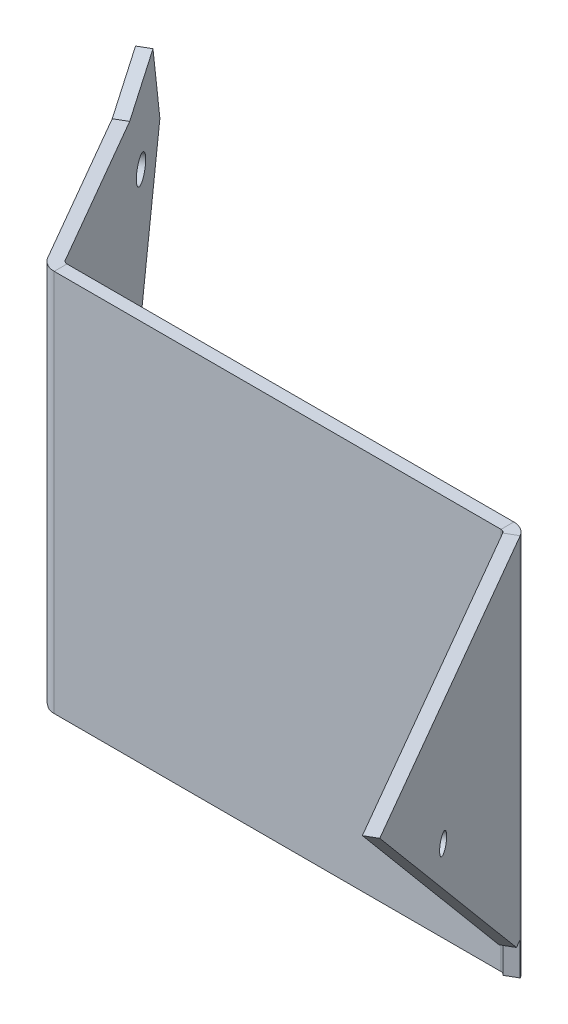
ISO-10303-21;
HEADER;
FILE_DESCRIPTION(('STEP AP214'),'2;1');
FILE_NAME('part.step','',(''),(''),'','','');
FILE_SCHEMA(('AUTOMOTIVE_DESIGN { 1 0 10303 214 1 1 1 1 }'));
ENDSEC;
DATA;
#1=APPLICATION_CONTEXT('core data for automotive mechanical design processes');
#2=APPLICATION_PROTOCOL_DEFINITION('international standard','automotive_design',2000,#1);
#3=PRODUCT_CONTEXT('',#1,'mechanical');
#4=PRODUCT('Part','Part','',(#3));
#5=PRODUCT_RELATED_PRODUCT_CATEGORY('part','',(#4));
#6=PRODUCT_DEFINITION_FORMATION('','',#4);
#7=PRODUCT_DEFINITION_CONTEXT('part definition',#1,'design');
#8=PRODUCT_DEFINITION('design','',#6,#7);
#9=PRODUCT_DEFINITION_SHAPE('','',#8);
#10=(LENGTH_UNIT() NAMED_UNIT(*) SI_UNIT(.MILLI.,.METRE.));
#11=(NAMED_UNIT(*) PLANE_ANGLE_UNIT() SI_UNIT($,.RADIAN.));
#12=(NAMED_UNIT(*) SI_UNIT($,.STERADIAN.) SOLID_ANGLE_UNIT());
#13=UNCERTAINTY_MEASURE_WITH_UNIT(LENGTH_MEASURE(1.E-05),#10,'distance_accuracy_value','');
#14=(GEOMETRIC_REPRESENTATION_CONTEXT(3) GLOBAL_UNCERTAINTY_ASSIGNED_CONTEXT((#13)) GLOBAL_UNIT_ASSIGNED_CONTEXT((#10,
#11,#12)) REPRESENTATION_CONTEXT('',''));
#15=CARTESIAN_POINT('',(0.,0.,0.));
#16=DIRECTION('',(0.,0.,1.));
#17=DIRECTION('',(1.,0.,0.));
#18=AXIS2_PLACEMENT_3D('',#15,#16,#17);
#19=CARTESIAN_POINT('',(-35.,-30.,-1.7366));
#20=DIRECTION('',(0.,-1.,0.));
#21=DIRECTION('',(0.,0.,-1.));
#22=AXIS2_PLACEMENT_3D('',#19,#20,#21);
#23=PLANE('',#22);
#24=CARTESIAN_POINT('',(-35.,-30.,-1.7366));
#25=DIRECTION('',(0.,1.,0.));
#26=DIRECTION('',(0.,0.,1.));
#27=AXIS2_PLACEMENT_3D('',#24,#25,#26);
#28=CIRCLE('',#27,2.73660000000001);
#29=CARTESIAN_POINT('',(-35.,-30.,1.));
#30=VERTEX_POINT('',#29);
#31=CARTESIAN_POINT('',(-35.9470482073754,-30.,0.83090447962747));
#32=VERTEX_POINT('',#31);
#33=EDGE_CURVE('E130',#30,#32,#28,.F.);
#34=ORIENTED_EDGE('',*,*,#33,.T.);
#35=DIRECTION('',(-0.346067458662351,0.,0.938209632254424));
#36=VECTOR('',#35,1.);
#37=CARTESIAN_POINT('',(-35.9470482073754,-30.,0.83090447962747));
#38=LINE('',#37,#36);
#39=CARTESIAN_POINT('',(-35.2549132900507,-30.,-1.04551478488138));
#40=VERTEX_POINT('',#39);
#41=EDGE_CURVE('E274',#32,#40,#38,.F.);
#42=ORIENTED_EDGE('',*,*,#41,.T.);
#43=CARTESIAN_POINT('',(-35.,-30.,-1.7366));
#44=DIRECTION('',(0.,1.,0.));
#45=DIRECTION('',(0.,0.,1.));
#46=AXIS2_PLACEMENT_3D('',#43,#44,#45);
#47=CIRCLE('',#46,0.736600000000014);
#48=CARTESIAN_POINT('',(-35.,-30.,-0.999999999999987));
#49=VERTEX_POINT('',#48);
#50=EDGE_CURVE('E150',#49,#40,#47,.F.);
#51=ORIENTED_EDGE('',*,*,#50,.F.);
#52=DIRECTION('',(0.,0.,1.));
#53=VECTOR('',#52,1.);
#54=CARTESIAN_POINT('',(-35.,-30.,-1.));
#55=LINE('',#54,#53);
#56=EDGE_CURVE('E93',#49,#30,#55,.T.);
#57=ORIENTED_EDGE('',*,*,#56,.T.);
#58=EDGE_LOOP('',(#34,#42,#51,#57));
#59=FACE_BOUND('',#58,.T.);
#60=ADVANCED_FACE('F83',(#59),#23,.T.);
#61=CARTESIAN_POINT('',(-35.,30.,-1.7366));
#62=DIRECTION('',(0.,1.,0.));
#63=DIRECTION('',(-0.866025403784436,0.,0.500000000000004));
#64=AXIS2_PLACEMENT_3D('',#61,#62,#63);
#65=CYLINDRICAL_SURFACE('',#64,2.73660000000001);
#66=DIRECTION('',(0.,1.,0.));
#67=VECTOR('',#66,1.);
#68=CARTESIAN_POINT('',(-37.3699651199965,-30.,-0.368299999999984));
#69=LINE('',#68,#67);
#70=CARTESIAN_POINT('',(-37.3699651199965,30.,-0.368299999999983));
#71=VERTEX_POINT('',#70);
#72=CARTESIAN_POINT('',(-37.3699651199965,-29.2156444685968,-0.368299999999982));
#73=VERTEX_POINT('',#72);
#74=EDGE_CURVE('E212',#71,#73,#69,.F.);
#75=ORIENTED_EDGE('',*,*,#74,.T.);
#76=CARTESIAN_POINT('',(-35.,-29.2156444685968,-1.7366));
#77=DIRECTION('',(0.204500330906686,0.912534086287316,0.354204963295023));
#78=DIRECTION('',(-0.456267043143662,0.409000661813368,-0.790277700544035));
#79=AXIS2_PLACEMENT_3D('',#76,#77,#78);
#80=ELLIPSE('',#79,2.99890167515165,2.73660000000001);
#81=EDGE_CURVE('E136',#32,#73,#80,.F.);
#82=ORIENTED_EDGE('',*,*,#81,.F.);
#83=ORIENTED_EDGE('',*,*,#33,.F.);
#84=DIRECTION('',(0.,-1.,0.));
#85=VECTOR('',#84,1.);
#86=CARTESIAN_POINT('',(-35.,-30.,1.));
#87=LINE('',#86,#85);
#88=CARTESIAN_POINT('',(-35.,30.,1.00000000000001));
#89=VERTEX_POINT('',#88);
#90=EDGE_CURVE('E134',#89,#30,#87,.T.);
#91=ORIENTED_EDGE('',*,*,#90,.F.);
#92=CARTESIAN_POINT('',(-35.,30.,-1.7366));
#93=DIRECTION('',(0.,1.,0.));
#94=DIRECTION('',(0.,0.,1.));
#95=AXIS2_PLACEMENT_3D('',#92,#93,#94);
#96=CIRCLE('',#95,2.73660000000001);
#97=EDGE_CURVE('E143',#71,#89,#96,.T.);
#98=ORIENTED_EDGE('',*,*,#97,.F.);
#99=EDGE_LOOP('',(#75,#82,#83,#91,#98));
#100=FACE_BOUND('',#99,.T.);
#101=ADVANCED_FACE('F129',(#100),#65,.T.);
#102=CARTESIAN_POINT('',(-35.,30.,-1.7366));
#103=DIRECTION('',(0.,1.,0.));
#104=DIRECTION('',(-0.866025403784436,0.,0.500000000000004));
#105=AXIS2_PLACEMENT_3D('',#102,#103,#104);
#106=CYLINDRICAL_SURFACE('',#105,0.736600000000014);
#107=CARTESIAN_POINT('',(-35.,-29.2156444685968,-1.7366));
#108=DIRECTION('',(0.428643385472539,0.514839190779579,0.742432121966761));
#109=DIRECTION('',(-0.257419595389791,0.857286770945072,-0.445863818078938));
#110=AXIS2_PLACEMENT_3D('',#107,#108,#109);
#111=ELLIPSE('',#110,1.4307380113869,0.736600000000014);
#112=CARTESIAN_POINT('',(-35.6379143124276,-29.2156444685968,-1.36829999999999));
#113=VERTEX_POINT('',#112);
#114=EDGE_CURVE('E396',#40,#113,#111,.F.);
#115=ORIENTED_EDGE('',*,*,#114,.T.);
#116=DIRECTION('',(0.,1.,0.));
#117=VECTOR('',#116,1.);
#118=CARTESIAN_POINT('',(-35.6379143124276,-30.,-1.36829999999999));
#119=LINE('',#118,#117);
#120=CARTESIAN_POINT('',(-35.6379143124276,30.,-1.36829999999999));
#121=VERTEX_POINT('',#120);
#122=EDGE_CURVE('E219',#113,#121,#119,.T.);
#123=ORIENTED_EDGE('',*,*,#122,.T.);
#124=CARTESIAN_POINT('',(-35.,30.,-1.7366));
#125=DIRECTION('',(0.,1.,0.));
#126=DIRECTION('',(0.,0.,1.));
#127=AXIS2_PLACEMENT_3D('',#124,#125,#126);
#128=CIRCLE('',#127,0.736600000000014);
#129=CARTESIAN_POINT('',(-35.,30.,-0.999999999999987));
#130=VERTEX_POINT('',#129);
#131=EDGE_CURVE('E214',#121,#130,#128,.T.);
#132=ORIENTED_EDGE('',*,*,#131,.T.);
#133=DIRECTION('',(0.,-1.,0.));
#134=VECTOR('',#133,1.);
#135=CARTESIAN_POINT('',(-35.,-30.,-1.));
#136=LINE('',#135,#134);
#137=EDGE_CURVE('E176',#130,#49,#136,.T.);
#138=ORIENTED_EDGE('',*,*,#137,.T.);
#139=ORIENTED_EDGE('',*,*,#50,.T.);
#140=EDGE_LOOP('',(#115,#123,#132,#138,#139));
#141=FACE_BOUND('',#140,.T.);
#142=ADVANCED_FACE('F237',(#141),#106,.F.);
#143=CARTESIAN_POINT('',(-27.9743143139616,0.,15.9054445662278));
#144=DIRECTION('',(0.866025403784436,0.,-0.500000000000004));
#145=DIRECTION('',(-0.500000000000004,0.,-0.866025403784436));
#146=AXIS2_PLACEMENT_3D('',#143,#144,#145);
#147=PLANE('',#146);
#148=CARTESIAN_POINT('',(-53.5868502366864,20.1820086657242,-28.4567689626141));
#149=DIRECTION('',(0.866025403784436,0.,-0.500000000000004));
#150=DIRECTION('',(-0.500000000000004,0.,-0.866025403784436));
#151=AXIS2_PLACEMENT_3D('',#148,#149,#150);
#152=CIRCLE('',#151,2.);
#153=CARTESIAN_POINT('',(-54.5868502366864,20.1820086657242,-30.188819770183));
#154=VERTEX_POINT('',#153);
#155=EDGE_CURVE('E391',#154,#154,#152,.T.);
#156=ORIENTED_EDGE('',*,*,#155,.T.);
#157=EDGE_LOOP('',(#156));
#158=FACE_BOUND('',#157,.T.);
#159=CARTESIAN_POINT('',(-45.7333551637979,-15.1,-14.8541164793796));
#160=DIRECTION('',(0.866025403784436,0.,-0.500000000000004));
#161=DIRECTION('',(-0.500000000000004,0.,-0.866025403784436));
#162=AXIS2_PLACEMENT_3D('',#159,#160,#161);
#163=CIRCLE('',#162,2.);
#164=CARTESIAN_POINT('',(-46.7333551637979,-15.1,-16.5861672869484));
#165=VERTEX_POINT('',#164);
#166=EDGE_CURVE('E479',#165,#165,#163,.T.);
#167=ORIENTED_EDGE('',*,*,#166,.T.);
#168=EDGE_LOOP('',(#167));
#169=FACE_BOUND('',#168,.T.);
#170=CARTESIAN_POINT('',(-41.2583551637979,-3.42,-7.10318911550885));
#171=DIRECTION('',(0.866025403784436,0.,-0.500000000000004));
#172=DIRECTION('',(-0.500000000000004,0.,-0.866025403784436));
#173=AXIS2_PLACEMENT_3D('',#170,#171,#172);
#174=CIRCLE('',#173,2.);
#175=CARTESIAN_POINT('',(-42.2583551637979,-3.42,-8.83523992307772));
#176=VERTEX_POINT('',#175);
#177=EDGE_CURVE('E482',#176,#176,#174,.T.);
#178=ORIENTED_EDGE('',*,*,#177,.T.);
#179=EDGE_LOOP('',(#178));
#180=FACE_BOUND('',#179,.T.);
#181=DIRECTION('',(-0.456267043143662,0.409000661813368,-0.790277700544035));
#182=VECTOR('',#181,1.);
#183=CARTESIAN_POINT('',(-36.4949651199965,-30.,1.14724445662281));
#184=LINE('',#183,#182);
#185=CARTESIAN_POINT('',(-50.2833551637979,-17.64,-22.7349476538179));
#186=VERTEX_POINT('',#185);
#187=EDGE_CURVE('E386',#73,#186,#184,.T.);
#188=ORIENTED_EDGE('',*,*,#187,.F.);
#189=ORIENTED_EDGE('',*,*,#74,.F.);
#190=DIRECTION('',(-0.500000000000004,0.,-0.866025403784436));
#191=VECTOR('',#190,1.);
#192=CARTESIAN_POINT('',(-27.9743143139616,30.,15.9054445662278));
#193=LINE('',#192,#191);
#194=CARTESIAN_POINT('',(-51.1599651199966,30.,-24.2532806363747));
#195=VERTEX_POINT('',#194);
#196=EDGE_CURVE('E209',#71,#195,#193,.T.);
#197=ORIENTED_EDGE('',*,*,#196,.T.);
#198=DIRECTION('',(-0.478115891966574,0.29261027903347,-0.828121016792209));
#199=VECTOR('',#198,1.);
#200=CARTESIAN_POINT('',(-61.2299651199967,36.1629106235044,-41.6950322685933));
#201=LINE('',#200,#199);
#202=CARTESIAN_POINT('',(-56.1468502366864,33.0520086657242,-32.8908190299904));
#203=VERTEX_POINT('',#202);
#204=EDGE_CURVE('E270',#195,#203,#201,.T.);
#205=ORIENTED_EDGE('',*,*,#204,.T.);
#206=DIRECTION('',(0.124858704044378,0.968318757485072,0.216261619172066));
#207=VECTOR('',#206,1.);
#208=CARTESIAN_POINT('',(-56.1468502366864,33.0520086657242,-32.8908190299904));
#209=LINE('',#208,#207);
#210=CARTESIAN_POINT('',(-57.6256988388714,21.5830698205205,-35.4522599456771));
#211=VERTEX_POINT('',#210);
#212=EDGE_CURVE('E105',#211,#203,#209,.T.);
#213=ORIENTED_EDGE('',*,*,#212,.F.);
#214=DIRECTION('',(-0.175310878262815,0.936517156196769,-0.303647348270715));
#215=VECTOR('',#214,1.);
#216=CARTESIAN_POINT('',(-50.2833551637979,-17.64,-22.7349476538179));
#217=LINE('',#216,#215);
#218=EDGE_CURVE('E384',#186,#211,#217,.T.);
#219=ORIENTED_EDGE('',*,*,#218,.F.);
#220=EDGE_LOOP('',(#188,#189,#197,#205,#213,#219));
#221=FACE_BOUND('',#220,.T.);
#222=ADVANCED_FACE('F409',(#158,#169,#180,#221),#147,.F.);
#223=CARTESIAN_POINT('',(-26.2422635063927,0.,14.9054445662278));
#224=DIRECTION('',(0.866025403784436,0.,-0.500000000000004));
#225=DIRECTION('',(-0.500000000000004,0.,-0.866025403784436));
#226=AXIS2_PLACEMENT_3D('',#223,#224,#225);
#227=PLANE('',#226);
#228=CARTESIAN_POINT('',(-51.8547994291175,20.1820086657242,-29.4567689626141));
#229=DIRECTION('',(0.866025403784436,0.,-0.500000000000004));
#230=DIRECTION('',(-0.500000000000004,0.,-0.866025403784436));
#231=AXIS2_PLACEMENT_3D('',#228,#229,#230);
#232=CIRCLE('',#231,2.);
#233=CARTESIAN_POINT('',(-52.8547994291175,20.1820086657242,-31.188819770183));
#234=VERTEX_POINT('',#233);
#235=EDGE_CURVE('E485',#234,#234,#232,.T.);
#236=ORIENTED_EDGE('',*,*,#235,.F.);
#237=EDGE_LOOP('',(#236));
#238=FACE_BOUND('',#237,.T.);
#239=CARTESIAN_POINT('',(-44.001304356229,-15.1,-15.8541164793796));
#240=DIRECTION('',(0.866025403784436,0.,-0.500000000000004));
#241=DIRECTION('',(-0.500000000000004,0.,-0.866025403784436));
#242=AXIS2_PLACEMENT_3D('',#239,#240,#241);
#243=CIRCLE('',#242,2.);
#244=CARTESIAN_POINT('',(-45.001304356229,-15.1,-17.5861672869484));
#245=VERTEX_POINT('',#244);
#246=EDGE_CURVE('E490',#245,#245,#243,.T.);
#247=ORIENTED_EDGE('',*,*,#246,.F.);
#248=EDGE_LOOP('',(#247));
#249=FACE_BOUND('',#248,.T.);
#250=CARTESIAN_POINT('',(-39.526304356229,-3.42,-8.10318911550886));
#251=DIRECTION('',(0.866025403784436,0.,-0.500000000000004));
#252=DIRECTION('',(-0.500000000000004,0.,-0.866025403784436));
#253=AXIS2_PLACEMENT_3D('',#250,#251,#252);
#254=CIRCLE('',#253,2.);
#255=CARTESIAN_POINT('',(-40.526304356229,-3.42,-9.83523992307773));
#256=VERTEX_POINT('',#255);
#257=EDGE_CURVE('E487',#256,#256,#254,.T.);
#258=ORIENTED_EDGE('',*,*,#257,.F.);
#259=EDGE_LOOP('',(#258));
#260=FACE_BOUND('',#259,.T.);
#261=ORIENTED_EDGE('',*,*,#122,.F.);
#262=DIRECTION('',(-0.456267043143662,0.409000661813368,-0.790277700544035));
#263=VECTOR('',#262,1.);
#264=CARTESIAN_POINT('',(-34.7629143124276,-30.,0.147244456622799));
#265=LINE('',#264,#263);
#266=CARTESIAN_POINT('',(-48.5513043562291,-17.64,-23.7349476538179));
#267=VERTEX_POINT('',#266);
#268=EDGE_CURVE('E376',#113,#267,#265,.T.);
#269=ORIENTED_EDGE('',*,*,#268,.T.);
#270=DIRECTION('',(-0.175310878262815,0.936517156196769,-0.303647348270715));
#271=VECTOR('',#270,1.);
#272=CARTESIAN_POINT('',(-48.5513043562291,-17.64,-23.7349476538179));
#273=LINE('',#272,#271);
#274=CARTESIAN_POINT('',(-55.8936480313026,21.5830698205205,-36.4522599456771));
#275=VERTEX_POINT('',#274);
#276=EDGE_CURVE('E380',#267,#275,#273,.T.);
#277=ORIENTED_EDGE('',*,*,#276,.T.);
#278=DIRECTION('',(0.124858704044378,0.968318757485072,0.216261619172066));
#279=VECTOR('',#278,1.);
#280=CARTESIAN_POINT('',(-54.4147994291175,33.0520086657242,-33.8908190299904));
#281=LINE('',#280,#279);
#282=CARTESIAN_POINT('',(-54.4147994291175,33.0520086657242,-33.8908190299904));
#283=VERTEX_POINT('',#282);
#284=EDGE_CURVE('E259',#275,#283,#281,.T.);
#285=ORIENTED_EDGE('',*,*,#284,.T.);
#286=DIRECTION('',(-0.478115891966574,0.29261027903347,-0.828121016792209));
#287=VECTOR('',#286,1.);
#288=CARTESIAN_POINT('',(-59.4979143124278,36.1629106235044,-42.6950322685933));
#289=LINE('',#288,#287);
#290=CARTESIAN_POINT('',(-49.4279143124277,30.,-25.2532806363747));
#291=VERTEX_POINT('',#290);
#292=EDGE_CURVE('E258',#291,#283,#289,.T.);
#293=ORIENTED_EDGE('',*,*,#292,.F.);
#294=DIRECTION('',(0.500000000000004,0.,0.866025403784436));
#295=VECTOR('',#294,1.);
#296=CARTESIAN_POINT('',(-69.8479259390957,30.,-60.6217782649106));
#297=LINE('',#296,#295);
#298=EDGE_CURVE('E211',#121,#291,#297,.F.);
#299=ORIENTED_EDGE('',*,*,#298,.F.);
#300=EDGE_LOOP('',(#261,#269,#277,#285,#293,#299));
#301=FACE_BOUND('',#300,.T.);
#302=ADVANCED_FACE('F253',(#238,#249,#260,#301),#227,.T.);
#303=CARTESIAN_POINT('',(-59.4979143124278,36.1629106235044,-42.6950322685933));
#304=DIRECTION('',(0.146305139516736,0.95623178393314,0.253407935051437));
#305=DIRECTION('',(0.,-0.256164389662942,0.966633232135442));
#306=AXIS2_PLACEMENT_3D('',#303,#304,#305);
#307=PLANE('',#306);
#308=ORIENTED_EDGE('',*,*,#292,.T.);
#309=DIRECTION('',(-0.866025403784436,0.,0.500000000000004));
#310=VECTOR('',#309,1.);
#311=CARTESIAN_POINT('',(-54.4147994291175,33.0520086657242,-33.8908190299904));
#312=LINE('',#311,#310);
#313=EDGE_CURVE('E371',#203,#283,#312,.F.);
#314=ORIENTED_EDGE('',*,*,#313,.F.);
#315=ORIENTED_EDGE('',*,*,#204,.F.);
#316=DIRECTION('',(-0.866025403784436,0.,0.500000000000004));
#317=VECTOR('',#316,1.);
#318=CARTESIAN_POINT('',(-49.4279143124277,30.,-25.2532806363747));
#319=LINE('',#318,#317);
#320=EDGE_CURVE('E266',#291,#195,#319,.T.);
#321=ORIENTED_EDGE('',*,*,#320,.F.);
#322=EDGE_LOOP('',(#308,#314,#315,#321));
#323=FACE_BOUND('',#322,.T.);
#324=ADVANCED_FACE('F415',(#323),#307,.T.);
#325=CARTESIAN_POINT('',(27.9743143139616,0.,-15.9054445662278));
#326=DIRECTION('',(-0.866025403784436,0.,0.500000000000004));
#327=DIRECTION('',(0.500000000000004,0.,0.866025403784436));
#328=AXIS2_PLACEMENT_3D('',#325,#326,#327);
#329=PLANE('',#328);
#330=CARTESIAN_POINT('',(53.8623289158171,10.7605467589142,28.9339120312704));
#331=DIRECTION('',(0.866025403784436,0.,-0.500000000000004));
#332=DIRECTION('',(-0.500000000000004,0.,-0.866025403784436));
#333=AXIS2_PLACEMENT_3D('',#330,#331,#332);
#334=CIRCLE('',#333,1.5);
#335=CARTESIAN_POINT('',(53.1123289158171,10.7605467589142,27.6348739255938));
#336=VERTEX_POINT('',#335);
#337=EDGE_CURVE('E493',#336,#336,#334,.T.);
#338=ORIENTED_EDGE('',*,*,#337,.F.);
#339=EDGE_LOOP('',(#338));
#340=FACE_BOUND('',#339,.T.);
#341=DIRECTION('',(-0.500000000000004,0.,-0.866025403784436));
#342=VECTOR('',#341,1.);
#343=CARTESIAN_POINT('',(52.3949709333305,-24.77,26.392373452712));
#344=LINE('',#343,#342);
#345=CARTESIAN_POINT('',(37.3699651199965,-24.77,0.368299999999989));
#346=VERTEX_POINT('',#345);
#347=CARTESIAN_POINT('',(38.169437800121,-24.77,1.75302730123891));
#348=VERTEX_POINT('',#347);
#349=EDGE_CURVE('E267',#346,#348,#344,.F.);
#350=ORIENTED_EDGE('',*,*,#349,.F.);
#351=DIRECTION('',(0.,1.,0.));
#352=VECTOR('',#351,1.);
#353=CARTESIAN_POINT('',(37.3699651199965,-30.,0.36829999999999));
#354=LINE('',#353,#352);
#355=CARTESIAN_POINT('',(37.3699651199965,30.,0.36829999999999));
#356=VERTEX_POINT('',#355);
#357=EDGE_CURVE('E307',#356,#346,#354,.F.);
#358=ORIENTED_EDGE('',*,*,#357,.F.);
#359=DIRECTION('',(0.500000000000004,0.,0.866025403784436));
#360=VECTOR('',#359,1.);
#361=CARTESIAN_POINT('',(27.9743143139616,30.,-15.9054445662278));
#362=LINE('',#361,#360);
#363=CARTESIAN_POINT('',(67.4199767466646,30.,52.416446905424));
#364=VERTEX_POINT('',#363);
#365=EDGE_CURVE('E296',#356,#364,#362,.T.);
#366=ORIENTED_EDGE('',*,*,#365,.T.);
#367=DIRECTION('',(0.365001256502186,0.683444460806663,0.63220072108826));
#368=VECTOR('',#367,1.);
#369=CARTESIAN_POINT('',(67.4199767466646,30.,52.416446905424));
#370=LINE('',#369,#368);
#371=EDGE_CURVE('E290',#348,#364,#370,.T.);
#372=ORIENTED_EDGE('',*,*,#371,.F.);
#373=EDGE_LOOP('',(#350,#358,#366,#372));
#374=FACE_BOUND('',#373,.T.);
#375=ADVANCED_FACE('F336',(#340,#374),#329,.F.);
#376=CARTESIAN_POINT('',(26.2422635063927,0.,-14.9054445662278));
#377=DIRECTION('',(-0.866025403784436,0.,0.500000000000004));
#378=DIRECTION('',(0.500000000000004,0.,0.866025403784436));
#379=AXIS2_PLACEMENT_3D('',#376,#377,#378);
#380=PLANE('',#379);
#381=CARTESIAN_POINT('',(52.1302781082482,10.7605467589142,29.9339120312704));
#382=DIRECTION('',(-0.866025403784436,0.,0.500000000000004));
#383=DIRECTION('',(0.500000000000004,0.,0.866025403784436));
#384=AXIS2_PLACEMENT_3D('',#381,#382,#383);
#385=CIRCLE('',#384,1.5);
#386=CARTESIAN_POINT('',(52.8802781082482,10.7605467589142,31.2329501369471));
#387=VERTEX_POINT('',#386);
#388=EDGE_CURVE('E498',#387,#387,#385,.F.);
#389=ORIENTED_EDGE('',*,*,#388,.T.);
#390=EDGE_LOOP('',(#389));
#391=FACE_BOUND('',#390,.T.);
#392=DIRECTION('',(0.,1.,0.));
#393=VECTOR('',#392,1.);
#394=CARTESIAN_POINT('',(35.6379143124276,-30.,1.3683));
#395=LINE('',#394,#393);
#396=CARTESIAN_POINT('',(35.6379143124276,-24.77,1.36829999999999));
#397=VERTEX_POINT('',#396);
#398=CARTESIAN_POINT('',(35.6379143124276,30.,1.3683));
#399=VERTEX_POINT('',#398);
#400=EDGE_CURVE('E313',#397,#399,#395,.T.);
#401=ORIENTED_EDGE('',*,*,#400,.F.);
#402=DIRECTION('',(0.500000000000004,0.,0.866025403784436));
#403=VECTOR('',#402,1.);
#404=CARTESIAN_POINT('',(35.6379143124276,-24.77,1.3683));
#405=LINE('',#404,#403);
#406=CARTESIAN_POINT('',(36.4373869925521,-24.77,2.75302730123892));
#407=VERTEX_POINT('',#406);
#408=EDGE_CURVE('E277',#397,#407,#405,.T.);
#409=ORIENTED_EDGE('',*,*,#408,.T.);
#410=DIRECTION('',(0.365001256502186,0.683444460806663,0.63220072108826));
#411=VECTOR('',#410,1.);
#412=CARTESIAN_POINT('',(65.6879259390957,30.,53.416446905424));
#413=LINE('',#412,#411);
#414=CARTESIAN_POINT('',(65.6879259390957,30.,53.416446905424));
#415=VERTEX_POINT('',#414);
#416=EDGE_CURVE('E282',#407,#415,#413,.T.);
#417=ORIENTED_EDGE('',*,*,#416,.T.);
#418=DIRECTION('',(-0.500000000000004,0.,-0.866025403784436));
#419=VECTOR('',#418,1.);
#420=CARTESIAN_POINT('',(65.6879259390957,30.,53.416446905424));
#421=LINE('',#420,#419);
#422=EDGE_CURVE('E303',#399,#415,#421,.F.);
#423=ORIENTED_EDGE('',*,*,#422,.F.);
#424=EDGE_LOOP('',(#401,#409,#417,#423));
#425=FACE_BOUND('',#424,.T.);
#426=ADVANCED_FACE('F419',(#391,#425),#380,.T.);
#427=CARTESIAN_POINT('',(-35.,-30.,-1.));
#428=DIRECTION('',(0.,-1.,0.));
#429=DIRECTION('',(0.,0.,-1.));
#430=AXIS2_PLACEMENT_3D('',#427,#428,#429);
#431=PLANE('',#430);
#432=DIRECTION('',(1.,0.,0.));
#433=VECTOR('',#432,1.);
#434=CARTESIAN_POINT('',(-35.,-30.,1.));
#435=LINE('',#434,#433);
#436=CARTESIAN_POINT('',(35.,-30.,1.));
#437=VERTEX_POINT('',#436);
#438=EDGE_CURVE('E160',#30,#437,#435,.T.);
#439=ORIENTED_EDGE('',*,*,#438,.F.);
#440=ORIENTED_EDGE('',*,*,#56,.F.);
#441=DIRECTION('',(1.,0.,0.));
#442=VECTOR('',#441,1.);
#443=CARTESIAN_POINT('',(-35.,-30.,-1.));
#444=LINE('',#443,#442);
#445=CARTESIAN_POINT('',(35.,-30.,-1.));
#446=VERTEX_POINT('',#445);
#447=EDGE_CURVE('E175',#49,#446,#444,.T.);
#448=ORIENTED_EDGE('',*,*,#447,.T.);
#449=DIRECTION('',(0.,0.,1.));
#450=VECTOR('',#449,1.);
#451=CARTESIAN_POINT('',(35.,-30.,-1.));
#452=LINE('',#451,#450);
#453=EDGE_CURVE('E13',#446,#437,#452,.T.);
#454=ORIENTED_EDGE('',*,*,#453,.T.);
#455=EDGE_LOOP('',(#439,#440,#448,#454));
#456=FACE_BOUND('',#455,.T.);
#457=ADVANCED_FACE('F164',(#456),#431,.T.);
#458=CARTESIAN_POINT('',(-35.,30.,-1.));
#459=DIRECTION('',(0.,1.,0.));
#460=DIRECTION('',(0.,0.,1.));
#461=AXIS2_PLACEMENT_3D('',#458,#459,#460);
#462=PLANE('',#461);
#463=DIRECTION('',(-1.,0.,0.));
#464=VECTOR('',#463,1.);
#465=CARTESIAN_POINT('',(-35.,30.,1.));
#466=LINE('',#465,#464);
#467=CARTESIAN_POINT('',(35.,30.,1.));
#468=VERTEX_POINT('',#467);
#469=EDGE_CURVE('E159',#468,#89,#466,.T.);
#470=ORIENTED_EDGE('',*,*,#469,.F.);
#471=DIRECTION('',(0.,0.,1.));
#472=VECTOR('',#471,1.);
#473=CARTESIAN_POINT('',(35.,30.,-1.));
#474=LINE('',#473,#472);
#475=CARTESIAN_POINT('',(35.,30.,-0.999999999999999));
#476=VERTEX_POINT('',#475);
#477=EDGE_CURVE('E88',#476,#468,#474,.T.);
#478=ORIENTED_EDGE('',*,*,#477,.F.);
#479=DIRECTION('',(-1.,0.,0.));
#480=VECTOR('',#479,1.);
#481=CARTESIAN_POINT('',(-35.,30.,-1.));
#482=LINE('',#481,#480);
#483=EDGE_CURVE('E163',#476,#130,#482,.T.);
#484=ORIENTED_EDGE('',*,*,#483,.T.);
#485=DIRECTION('',(0.,0.,1.));
#486=VECTOR('',#485,1.);
#487=CARTESIAN_POINT('',(-35.,30.,-1.));
#488=LINE('',#487,#486);
#489=EDGE_CURVE('E146',#130,#89,#488,.T.);
#490=ORIENTED_EDGE('',*,*,#489,.T.);
#491=EDGE_LOOP('',(#470,#478,#484,#490));
#492=FACE_BOUND('',#491,.T.);
#493=ADVANCED_FACE('F86',(#492),#462,.T.);
#494=CARTESIAN_POINT('',(0.,0.,-1.));
#495=DIRECTION('',(0.,0.,-1.));
#496=DIRECTION('',(-1.,0.,0.));
#497=AXIS2_PLACEMENT_3D('',#494,#495,#496);
#498=PLANE('',#497);
#499=DIRECTION('',(0.,1.,0.));
#500=VECTOR('',#499,1.);
#501=CARTESIAN_POINT('',(35.,-30.,-1.));
#502=LINE('',#501,#500);
#503=EDGE_CURVE('E113',#446,#476,#502,.T.);
#504=ORIENTED_EDGE('',*,*,#503,.F.);
#505=ORIENTED_EDGE('',*,*,#447,.F.);
#506=ORIENTED_EDGE('',*,*,#137,.F.);
#507=ORIENTED_EDGE('',*,*,#483,.F.);
#508=EDGE_LOOP('',(#504,#505,#506,#507));
#509=FACE_BOUND('',#508,.T.);
#510=ADVANCED_FACE('F226',(#509),#498,.T.);
#511=CARTESIAN_POINT('',(0.,0.,1.));
#512=DIRECTION('',(0.,0.,-1.));
#513=DIRECTION('',(-1.,0.,0.));
#514=AXIS2_PLACEMENT_3D('',#511,#512,#513);
#515=PLANE('',#514);
#516=DIRECTION('',(0.,1.,0.));
#517=VECTOR('',#516,1.);
#518=CARTESIAN_POINT('',(35.,-30.,1.));
#519=LINE('',#518,#517);
#520=EDGE_CURVE('E137',#437,#468,#519,.T.);
#521=ORIENTED_EDGE('',*,*,#520,.T.);
#522=ORIENTED_EDGE('',*,*,#469,.T.);
#523=ORIENTED_EDGE('',*,*,#90,.T.);
#524=ORIENTED_EDGE('',*,*,#438,.T.);
#525=EDGE_LOOP('',(#521,#522,#523,#524));
#526=FACE_BOUND('',#525,.T.);
#527=ADVANCED_FACE('F157',(#526),#515,.F.);
#528=CARTESIAN_POINT('',(-35.,30.,-1.7366));
#529=DIRECTION('',(0.,-1.,0.));
#530=DIRECTION('',(0.,0.,-1.));
#531=AXIS2_PLACEMENT_3D('',#528,#529,#530);
#532=PLANE('',#531);
#533=ORIENTED_EDGE('',*,*,#131,.F.);
#534=ORIENTED_EDGE('',*,*,#298,.T.);
#535=ORIENTED_EDGE('',*,*,#320,.T.);
#536=ORIENTED_EDGE('',*,*,#196,.F.);
#537=ORIENTED_EDGE('',*,*,#97,.T.);
#538=ORIENTED_EDGE('',*,*,#489,.F.);
#539=EDGE_LOOP('',(#533,#534,#535,#536,#537,#538));
#540=FACE_BOUND('',#539,.T.);
#541=ADVANCED_FACE('F247',(#540),#532,.F.);
#542=CARTESIAN_POINT('',(35.,-30.,1.7366));
#543=DIRECTION('',(0.,-1.,0.));
#544=DIRECTION('',(0.,0.,-1.));
#545=AXIS2_PLACEMENT_3D('',#542,#543,#544);
#546=PLANE('',#545);
#547=DIRECTION('',(-0.866025403784436,0.,0.500000000000004));
#548=VECTOR('',#547,1.);
#549=CARTESIAN_POINT('',(37.3699651199965,-30.,0.368299999999987));
#550=LINE('',#549,#548);
#551=CARTESIAN_POINT('',(35.6379143124276,-30.,1.3683));
#552=VERTEX_POINT('',#551);
#553=CARTESIAN_POINT('',(37.3699651199965,-30.,0.368299999999989));
#554=VERTEX_POINT('',#553);
#555=EDGE_CURVE('E197',#552,#554,#550,.F.);
#556=ORIENTED_EDGE('',*,*,#555,.F.);
#557=CARTESIAN_POINT('',(35.,-30.,1.7366));
#558=DIRECTION('',(0.,1.,0.));
#559=DIRECTION('',(0.,0.,1.));
#560=AXIS2_PLACEMENT_3D('',#557,#558,#559);
#561=CIRCLE('',#560,0.736599999999998);
#562=EDGE_CURVE('E187',#437,#552,#561,.F.);
#563=ORIENTED_EDGE('',*,*,#562,.F.);
#564=ORIENTED_EDGE('',*,*,#453,.F.);
#565=CARTESIAN_POINT('',(35.,-30.,1.7366));
#566=DIRECTION('',(0.,1.,0.));
#567=DIRECTION('',(0.,0.,1.));
#568=AXIS2_PLACEMENT_3D('',#565,#566,#567);
#569=CIRCLE('',#568,2.7366);
#570=EDGE_CURVE('E205',#446,#554,#569,.F.);
#571=ORIENTED_EDGE('',*,*,#570,.T.);
#572=EDGE_LOOP('',(#556,#563,#564,#571));
#573=FACE_BOUND('',#572,.T.);
#574=ADVANCED_FACE('F194',(#573),#546,.T.);
#575=CARTESIAN_POINT('',(35.,30.,1.7366));
#576=DIRECTION('',(0.,-1.,0.));
#577=DIRECTION('',(0.,0.,-1.));
#578=AXIS2_PLACEMENT_3D('',#575,#576,#577);
#579=PLANE('',#578);
#580=CARTESIAN_POINT('',(35.,30.,1.7366));
#581=DIRECTION('',(0.,1.,0.));
#582=DIRECTION('',(0.,0.,1.));
#583=AXIS2_PLACEMENT_3D('',#580,#581,#582);
#584=CIRCLE('',#583,0.736599999999998);
#585=EDGE_CURVE('E195',#399,#468,#584,.T.);
#586=ORIENTED_EDGE('',*,*,#585,.F.);
#587=DIRECTION('',(-0.866025403784436,0.,0.500000000000004));
#588=VECTOR('',#587,1.);
#589=CARTESIAN_POINT('',(35.6379143124276,30.,1.36829999999999));
#590=LINE('',#589,#588);
#591=EDGE_CURVE('E309',#399,#356,#590,.F.);
#592=ORIENTED_EDGE('',*,*,#591,.T.);
#593=CARTESIAN_POINT('',(35.,30.,1.7366));
#594=DIRECTION('',(0.,1.,0.));
#595=DIRECTION('',(0.,0.,1.));
#596=AXIS2_PLACEMENT_3D('',#593,#594,#595);
#597=CIRCLE('',#596,2.7366);
#598=EDGE_CURVE('E199',#356,#476,#597,.T.);
#599=ORIENTED_EDGE('',*,*,#598,.T.);
#600=ORIENTED_EDGE('',*,*,#477,.T.);
#601=EDGE_LOOP('',(#586,#592,#599,#600));
#602=FACE_BOUND('',#601,.T.);
#603=ADVANCED_FACE('F464',(#602),#579,.F.);
#604=CARTESIAN_POINT('',(35.,30.,1.7366));
#605=DIRECTION('',(0.,1.,0.));
#606=DIRECTION('',(0.866025403784436,0.,-0.500000000000004));
#607=AXIS2_PLACEMENT_3D('',#604,#605,#606);
#608=CYLINDRICAL_SURFACE('',#607,2.7366);
#609=ORIENTED_EDGE('',*,*,#503,.T.);
#610=ORIENTED_EDGE('',*,*,#598,.F.);
#611=ORIENTED_EDGE('',*,*,#357,.T.);
#612=DIRECTION('',(0.,1.,0.));
#613=VECTOR('',#612,1.);
#614=CARTESIAN_POINT('',(37.3699651199965,0.,0.368299999999988));
#615=LINE('',#614,#613);
#616=EDGE_CURVE('E285',#554,#346,#615,.T.);
#617=ORIENTED_EDGE('',*,*,#616,.F.);
#618=ORIENTED_EDGE('',*,*,#570,.F.);
#619=EDGE_LOOP('',(#609,#610,#611,#617,#618));
#620=FACE_BOUND('',#619,.T.);
#621=ADVANCED_FACE('F319',(#620),#608,.T.);
#622=CARTESIAN_POINT('',(35.,30.,1.7366));
#623=DIRECTION('',(0.,1.,0.));
#624=DIRECTION('',(0.866025403784436,0.,-0.500000000000004));
#625=AXIS2_PLACEMENT_3D('',#622,#623,#624);
#626=CYLINDRICAL_SURFACE('',#625,0.736599999999998);
#627=ORIENTED_EDGE('',*,*,#520,.F.);
#628=ORIENTED_EDGE('',*,*,#562,.T.);
#629=EDGE_CURVE('E311',#552,#397,#395,.T.);
#630=ORIENTED_EDGE('',*,*,#629,.T.);
#631=ORIENTED_EDGE('',*,*,#400,.T.);
#632=ORIENTED_EDGE('',*,*,#585,.T.);
#633=EDGE_LOOP('',(#627,#628,#630,#631,#632));
#634=FACE_BOUND('',#633,.T.);
#635=ADVANCED_FACE('F190',(#634),#626,.F.);
#636=CARTESIAN_POINT('',(67.4199767466646,30.,52.416446905424));
#637=DIRECTION('',(0.,-1.,0.));
#638=DIRECTION('',(0.,0.,-1.));
#639=AXIS2_PLACEMENT_3D('',#636,#637,#638);
#640=PLANE('',#639);
#641=ORIENTED_EDGE('',*,*,#591,.F.);
#642=ORIENTED_EDGE('',*,*,#422,.T.);
#643=DIRECTION('',(-0.866025403784436,0.,0.500000000000004));
#644=VECTOR('',#643,1.);
#645=CARTESIAN_POINT('',(67.4199767466646,30.,52.416446905424));
#646=LINE('',#645,#644);
#647=EDGE_CURVE('E203',#364,#415,#646,.T.);
#648=ORIENTED_EDGE('',*,*,#647,.F.);
#649=ORIENTED_EDGE('',*,*,#365,.F.);
#650=EDGE_LOOP('',(#641,#642,#648,#649));
#651=FACE_BOUND('',#650,.T.);
#652=ADVANCED_FACE('F454',(#651),#640,.F.);
#653=CARTESIAN_POINT('',(35.6379143124276,-30.,1.3683));
#654=DIRECTION('',(-0.500000000000004,0.,-0.866025403784436));
#655=DIRECTION('',(0.,1.,0.));
#656=AXIS2_PLACEMENT_3D('',#653,#654,#655);
#657=PLANE('',#656);
#658=ORIENTED_EDGE('',*,*,#555,.T.);
#659=ORIENTED_EDGE('',*,*,#616,.T.);
#660=DIRECTION('',(0.866025403784436,0.,-0.500000000000004));
#661=VECTOR('',#660,1.);
#662=CARTESIAN_POINT('',(35.6379143124276,-24.77,1.36829999999999));
#663=LINE('',#662,#661);
#664=EDGE_CURVE('E292',#346,#397,#663,.F.);
#665=ORIENTED_EDGE('',*,*,#664,.T.);
#666=ORIENTED_EDGE('',*,*,#629,.F.);
#667=EDGE_LOOP('',(#658,#659,#665,#666));
#668=FACE_BOUND('',#667,.T.);
#669=ADVANCED_FACE('F323',(#668),#657,.F.);
#670=CARTESIAN_POINT('',(35.6379143124276,-24.77,1.3683));
#671=DIRECTION('',(0.,1.,0.));
#672=DIRECTION('',(0.500000000000004,0.,0.866025403784436));
#673=AXIS2_PLACEMENT_3D('',#670,#671,#672);
#674=PLANE('',#673);
#675=ORIENTED_EDGE('',*,*,#664,.F.);
#676=ORIENTED_EDGE('',*,*,#349,.T.);
#677=DIRECTION('',(0.866025403784436,0.,-0.500000000000004));
#678=VECTOR('',#677,1.);
#679=CARTESIAN_POINT('',(36.4373869925521,-24.77,2.75302730123892));
#680=LINE('',#679,#678);
#681=EDGE_CURVE('E283',#348,#407,#680,.F.);
#682=ORIENTED_EDGE('',*,*,#681,.T.);
#683=ORIENTED_EDGE('',*,*,#408,.F.);
#684=EDGE_LOOP('',(#675,#676,#682,#683));
#685=FACE_BOUND('',#684,.T.);
#686=ADVANCED_FACE('F335',(#685),#674,.F.);
#687=CARTESIAN_POINT('',(65.6879259390957,30.,53.416446905424));
#688=DIRECTION('',(-0.341722230403334,0.730002513004366,-0.591880265134327));
#689=DIRECTION('',(0.365001256502186,0.683444460806663,0.63220072108826));
#690=AXIS2_PLACEMENT_3D('',#687,#688,#689);
#691=PLANE('',#690);
#692=ORIENTED_EDGE('',*,*,#371,.T.);
#693=ORIENTED_EDGE('',*,*,#647,.T.);
#694=ORIENTED_EDGE('',*,*,#416,.F.);
#695=ORIENTED_EDGE('',*,*,#681,.F.);
#696=EDGE_LOOP('',(#692,#693,#694,#695));
#697=FACE_BOUND('',#696,.T.);
#698=ADVANCED_FACE('F343',(#697),#691,.F.);
#699=CARTESIAN_POINT('',(-36.3683,-27.9890916987466,-4.1065651199965));
#700=CARTESIAN_POINT('',(-36.0349666666667,-27.9890916987466,-3.52921485080688));
#701=CARTESIAN_POINT('',(-35.7016333333333,-27.9890916987466,-2.95186458161725));
#702=CARTESIAN_POINT('',(-35.3683,-27.9890916987466,-2.37451431242763));
#703=CARTESIAN_POINT('',(-31.628369760007,-27.9890916987466,-6.84316511999654));
#704=CARTESIAN_POINT('',(-32.4497369650529,-27.9890916987466,-5.59914818414024));
#705=CARTESIAN_POINT('',(-33.2711041700988,-27.9890916987466,-4.35513124828395));
#706=CARTESIAN_POINT('',(-34.0924713751447,-27.9890916987466,-3.11111431242765));
#707=CARTESIAN_POINT('',(-28.891769760007,-30.442197238447,-2.10323488000353));
#708=CARTESIAN_POINT('',(-30.3798036317196,-30.442197238447,-2.01391848252649));
#709=CARTESIAN_POINT('',(-31.8678375034321,-30.442197238447,-1.92460208504944));
#710=CARTESIAN_POINT('',(-33.3558713751447,-30.442197238447,-1.83528568757239));
#711=CARTESIAN_POINT('',(-33.6317,-30.442197238447,0.6333651199965));
#712=CARTESIAN_POINT('',(-33.9650333333333,-30.442197238447,0.0560148508068755));
#713=CARTESIAN_POINT('',(-34.2983666666666,-30.442197238447,-0.521335418382749));
#714=CARTESIAN_POINT('',(-34.6317,-30.442197238447,-1.09868568757237));
#715=CARTESIAN_POINT('',(-38.371630239993,-30.442197238447,3.36996511999653));
#716=CARTESIAN_POINT('',(-37.5502630349471,-30.442197238447,2.12594818414024));
#717=CARTESIAN_POINT('',(-36.7288958299012,-30.442197238447,0.881931248283942));
#718=CARTESIAN_POINT('',(-35.9075286248552,-30.442197238447,-0.362085687572353));
#719=CARTESIAN_POINT('',(-41.108230239993,-27.9890916987466,-1.36996511999647));
#720=CARTESIAN_POINT('',(-39.6201963682804,-27.9890916987466,-1.45928151747352));
#721=CARTESIAN_POINT('',(-38.1321624965679,-27.9890916987466,-1.54859791495056));
#722=CARTESIAN_POINT('',(-36.6441286248553,-27.9890916987466,-1.63791431242761));
#723=CARTESIAN_POINT('',(-36.3683,-27.9890916987466,-4.1065651199965));
#724=CARTESIAN_POINT('',(-36.0349666666667,-27.9890916987466,-3.52921485080688));
#725=CARTESIAN_POINT('',(-35.7016333333333,-27.9890916987466,-2.95186458161725));
#726=CARTESIAN_POINT('',(-35.3683,-27.9890916987466,-2.37451431242763));
#727=(BOUNDED_SURFACE() B_SPLINE_SURFACE(3,3,((#699,#700,#701,#702),(#703,#704,#705,#706),(#707,
#708,#709,#710),(#711,#712,#713,#714),(#715,#716,#717,#718),(#719,#720,#721,#722),(#723,#724,
#725,#726)),.UNSPECIFIED.,.T.,.F.,.F.) B_SPLINE_SURFACE_WITH_KNOTS((4,3,4),(4,4),(0.,0.5,1.),
(0.,1.),.UNSPECIFIED.) GEOMETRIC_REPRESENTATION_ITEM() RATIONAL_B_SPLINE_SURFACE(((1.,1.,1.,1.),
(0.333333333333333,0.333333333333333,0.333333333333333,0.333333333333333),(0.333333333333333,
0.333333333333333,0.333333333333333,0.333333333333333),(1.,1.,1.,1.),(0.333333333333333,
0.333333333333333,0.333333333333333,0.333333333333333),(0.333333333333333,0.333333333333333,
0.333333333333333,0.333333333333333),(1.,1.,1.,1.))) REPRESENTATION_ITEM('') SURFACE());
#728=DIRECTION('',(-0.866025403784436,0.,0.500000000000004));
#729=VECTOR('',#728,1.);
#730=CARTESIAN_POINT('',(-37.3699651199965,-29.2156444685968,-0.36829999999998));
#731=LINE('',#730,#729);
#732=EDGE_CURVE('E275',#73,#113,#731,.F.);
#733=ORIENTED_EDGE('',*,*,#81,.T.);
#734=ORIENTED_EDGE('',*,*,#732,.T.);
#735=ORIENTED_EDGE('',*,*,#114,.F.);
#736=ORIENTED_EDGE('',*,*,#41,.F.);
#737=EDGE_LOOP('',(#733,#734,#735,#736));
#738=FACE_BOUND('',#737,.T.);
#739=ADVANCED_FACE('F404',(#738),#727,.T.);
#740=CARTESIAN_POINT('',(-34.7629143124276,-30.,0.147244456622799));
#741=DIRECTION('',(0.204500330906685,0.912534086287316,0.354204963295023));
#742=DIRECTION('',(-0.456267043143662,0.409000661813368,-0.790277700544035));
#743=AXIS2_PLACEMENT_3D('',#740,#741,#742);
#744=PLANE('',#743);
#745=ORIENTED_EDGE('',*,*,#732,.F.);
#746=ORIENTED_EDGE('',*,*,#187,.T.);
#747=DIRECTION('',(-0.866025403784436,0.,0.500000000000004));
#748=VECTOR('',#747,1.);
#749=CARTESIAN_POINT('',(-48.5513043562291,-17.64,-23.7349476538179));
#750=LINE('',#749,#748);
#751=EDGE_CURVE('E383',#186,#267,#750,.F.);
#752=ORIENTED_EDGE('',*,*,#751,.T.);
#753=ORIENTED_EDGE('',*,*,#268,.F.);
#754=EDGE_LOOP('',(#745,#746,#752,#753));
#755=FACE_BOUND('',#754,.T.);
#756=ADVANCED_FACE('F407',(#755),#744,.F.);
#757=CARTESIAN_POINT('',(-48.5513043562291,-17.64,-23.7349476538179));
#758=DIRECTION('',(0.468258578098388,0.350621756525628,0.811047648346359));
#759=DIRECTION('',(-0.175310878262815,0.936517156196769,-0.303647348270715));
#760=AXIS2_PLACEMENT_3D('',#757,#758,#759);
#761=PLANE('',#760);
#762=ORIENTED_EDGE('',*,*,#751,.F.);
#763=ORIENTED_EDGE('',*,*,#218,.T.);
#764=DIRECTION('',(-0.866025403784436,0.,0.500000000000004));
#765=VECTOR('',#764,1.);
#766=CARTESIAN_POINT('',(-55.8936480313026,21.5830698205205,-36.4522599456771));
#767=LINE('',#766,#765);
#768=EDGE_CURVE('E374',#211,#275,#767,.F.);
#769=ORIENTED_EDGE('',*,*,#768,.T.);
#770=ORIENTED_EDGE('',*,*,#276,.F.);
#771=EDGE_LOOP('',(#762,#763,#769,#770));
#772=FACE_BOUND('',#771,.T.);
#773=ADVANCED_FACE('F382',(#772),#761,.F.);
#774=CARTESIAN_POINT('',(-54.4147994291175,33.0520086657242,-33.8908190299904));
#775=DIRECTION('',(0.48415937874254,-0.249717408088754,0.838588642943054));
#776=DIRECTION('',(0.124858704044378,0.968318757485072,0.216261619172066));
#777=AXIS2_PLACEMENT_3D('',#774,#775,#776);
#778=PLANE('',#777);
#779=ORIENTED_EDGE('',*,*,#212,.T.);
#780=ORIENTED_EDGE('',*,*,#313,.T.);
#781=ORIENTED_EDGE('',*,*,#284,.F.);
#782=ORIENTED_EDGE('',*,*,#768,.F.);
#783=EDGE_LOOP('',(#779,#780,#781,#782));
#784=FACE_BOUND('',#783,.T.);
#785=ADVANCED_FACE('F373',(#784),#778,.F.);
#786=CARTESIAN_POINT('',(-48.1865583940733,-3.42,-3.10318911550882));
#787=DIRECTION('',(0.866025403784436,0.,-0.500000000000004));
#788=DIRECTION('',(-0.500000000000004,0.,-0.866025403784436));
#789=AXIS2_PLACEMENT_3D('',#786,#787,#788);
#790=CYLINDRICAL_SURFACE('',#789,2.);
#791=ORIENTED_EDGE('',*,*,#257,.T.);
#792=EDGE_LOOP('',(#791));
#793=FACE_BOUND('',#792,.T.);
#794=ORIENTED_EDGE('',*,*,#177,.F.);
#795=EDGE_LOOP('',(#794));
#796=FACE_BOUND('',#795,.T.);
#797=ADVANCED_FACE('F513',(#793,#796),#790,.F.);
#798=CARTESIAN_POINT('',(-52.6615583940734,-15.1,-10.8541164793795));
#799=DIRECTION('',(0.866025403784436,0.,-0.500000000000004));
#800=DIRECTION('',(-0.500000000000004,0.,-0.866025403784436));
#801=AXIS2_PLACEMENT_3D('',#798,#799,#800);
#802=CYLINDRICAL_SURFACE('',#801,2.);
#803=ORIENTED_EDGE('',*,*,#246,.T.);
#804=EDGE_LOOP('',(#803));
#805=FACE_BOUND('',#804,.T.);
#806=ORIENTED_EDGE('',*,*,#166,.F.);
#807=EDGE_LOOP('',(#806));
#808=FACE_BOUND('',#807,.T.);
#809=ADVANCED_FACE('F509',(#805,#808),#802,.F.);
#810=CARTESIAN_POINT('',(-60.5150534669619,20.1820086657242,-24.456768962614));
#811=DIRECTION('',(0.866025403784436,0.,-0.500000000000004));
#812=DIRECTION('',(-0.500000000000004,0.,-0.866025403784436));
#813=AXIS2_PLACEMENT_3D('',#810,#811,#812);
#814=CYLINDRICAL_SURFACE('',#813,2.);
#815=ORIENTED_EDGE('',*,*,#235,.T.);
#816=EDGE_LOOP('',(#815));
#817=FACE_BOUND('',#816,.T.);
#818=ORIENTED_EDGE('',*,*,#155,.F.);
#819=EDGE_LOOP('',(#818));
#820=FACE_BOUND('',#819,.T.);
#821=ADVANCED_FACE('F505',(#817,#820),#814,.F.);
#822=CARTESIAN_POINT('',(48.4560434940734,10.7605467589142,32.0552323748301));
#823=DIRECTION('',(0.866025403784436,0.,-0.500000000000004));
#824=DIRECTION('',(-0.500000000000004,0.,-0.866025403784436));
#825=AXIS2_PLACEMENT_3D('',#822,#823,#824);
#826=CYLINDRICAL_SURFACE('',#825,1.5);
#827=ORIENTED_EDGE('',*,*,#337,.T.);
#828=EDGE_LOOP('',(#827));
#829=FACE_BOUND('',#828,.T.);
#830=ORIENTED_EDGE('',*,*,#388,.F.);
#831=EDGE_LOOP('',(#830));
#832=FACE_BOUND('',#831,.T.);
#833=ADVANCED_FACE('F501',(#829,#832),#826,.F.);
#834=CLOSED_SHELL('',(#60,#101,#142,#222,#302,#324,#375,#426,#457,#493,#510,#527,#541,#574,#603,
#621,#635,#652,#669,#686,#698,#739,#756,#773,#785,#797,#809,#821,#833));
#835=MANIFOLD_SOLID_BREP('B2',#834);
#836=ADVANCED_BREP_SHAPE_REPRESENTATION('',(#18,#835),#14);
#837=SHAPE_DEFINITION_REPRESENTATION(#9,#836);
ENDSEC;
END-ISO-10303-21;
